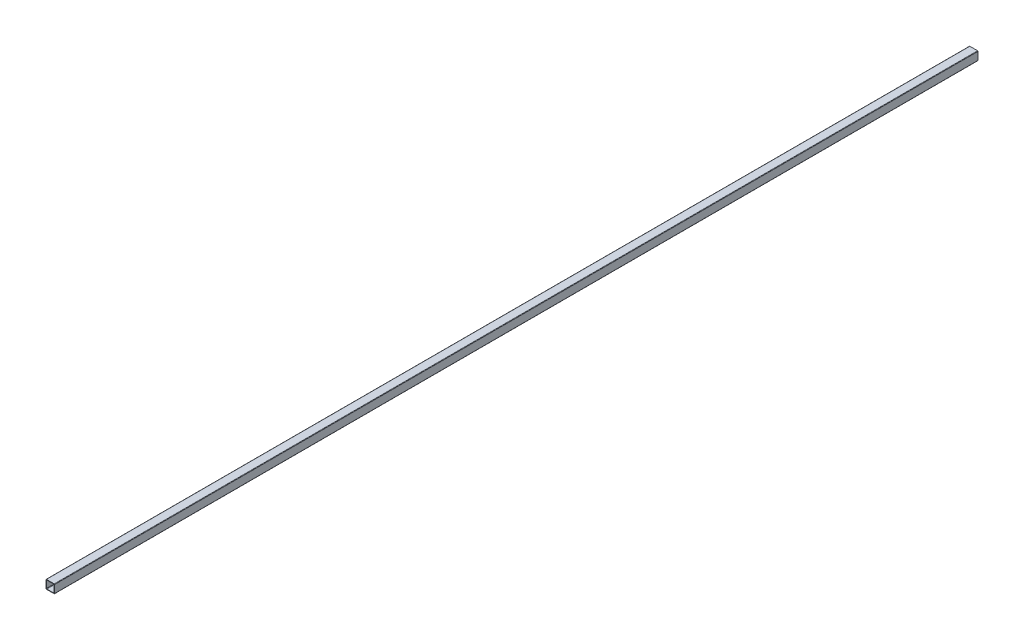
ISO-10303-21;
HEADER;
FILE_DESCRIPTION(('STEP AP214'),'2;1');
FILE_NAME('part.step','',(''),(''),'','','');
FILE_SCHEMA(('AUTOMOTIVE_DESIGN { 1 0 10303 214 1 1 1 1 }'));
ENDSEC;
DATA;
#1=APPLICATION_CONTEXT('core data for automotive mechanical design processes');
#2=APPLICATION_PROTOCOL_DEFINITION('international standard','automotive_design',2000,#1);
#3=PRODUCT_CONTEXT('',#1,'mechanical');
#4=PRODUCT('Part','Part','',(#3));
#5=PRODUCT_RELATED_PRODUCT_CATEGORY('part','',(#4));
#6=PRODUCT_DEFINITION_FORMATION('','',#4);
#7=PRODUCT_DEFINITION_CONTEXT('part definition',#1,'design');
#8=PRODUCT_DEFINITION('design','',#6,#7);
#9=PRODUCT_DEFINITION_SHAPE('','',#8);
#10=(LENGTH_UNIT() NAMED_UNIT(*) SI_UNIT(.MILLI.,.METRE.));
#11=(NAMED_UNIT(*) PLANE_ANGLE_UNIT() SI_UNIT($,.RADIAN.));
#12=(NAMED_UNIT(*) SI_UNIT($,.STERADIAN.) SOLID_ANGLE_UNIT());
#13=UNCERTAINTY_MEASURE_WITH_UNIT(LENGTH_MEASURE(1.E-05),#10,'distance_accuracy_value','');
#14=(GEOMETRIC_REPRESENTATION_CONTEXT(3) GLOBAL_UNCERTAINTY_ASSIGNED_CONTEXT((#13)) GLOBAL_UNIT_ASSIGNED_CONTEXT((#10,
#11,#12)) REPRESENTATION_CONTEXT('',''));
#15=CARTESIAN_POINT('',(0.,0.,0.));
#16=DIRECTION('',(0.,0.,1.));
#17=DIRECTION('',(1.,0.,0.));
#18=AXIS2_PLACEMENT_3D('',#15,#16,#17);
#19=CARTESIAN_POINT('',(18.,18.,4300.));
#20=DIRECTION('',(0.,0.,1.));
#21=DIRECTION('',(1.,0.,0.));
#22=AXIS2_PLACEMENT_3D('',#19,#20,#21);
#23=PLANE('',#22);
#24=CARTESIAN_POINT('',(18.,18.,4300.));
#25=DIRECTION('',(0.,0.,1.));
#26=DIRECTION('',(1.,0.,0.));
#27=AXIS2_PLACEMENT_3D('',#24,#25,#26);
#28=CIRCLE('',#27,2.);
#29=CARTESIAN_POINT('',(20.,18.,4300.));
#30=VERTEX_POINT('',#29);
#31=CARTESIAN_POINT('',(18.,20.,4300.));
#32=VERTEX_POINT('',#31);
#33=EDGE_CURVE('E213',#30,#32,#28,.T.);
#34=ORIENTED_EDGE('',*,*,#33,.T.);
#35=DIRECTION('',(-1.,0.,0.));
#36=VECTOR('',#35,1.);
#37=CARTESIAN_POINT('',(18.,20.,4300.));
#38=LINE('',#37,#36);
#39=CARTESIAN_POINT('',(-18.,20.,4300.));
#40=VERTEX_POINT('',#39);
#41=EDGE_CURVE('E216',#32,#40,#38,.T.);
#42=ORIENTED_EDGE('',*,*,#41,.T.);
#43=CARTESIAN_POINT('',(-18.,18.,4300.));
#44=DIRECTION('',(0.,0.,1.));
#45=DIRECTION('',(1.,0.,0.));
#46=AXIS2_PLACEMENT_3D('',#43,#44,#45);
#47=CIRCLE('',#46,2.);
#48=CARTESIAN_POINT('',(-20.,18.,4300.));
#49=VERTEX_POINT('',#48);
#50=EDGE_CURVE('E219',#40,#49,#47,.T.);
#51=ORIENTED_EDGE('',*,*,#50,.T.);
#52=DIRECTION('',(0.,-1.,0.));
#53=VECTOR('',#52,1.);
#54=CARTESIAN_POINT('',(-20.,-18.,4300.));
#55=LINE('',#54,#53);
#56=CARTESIAN_POINT('',(-20.,-18.,4300.));
#57=VERTEX_POINT('',#56);
#58=EDGE_CURVE('E221',#49,#57,#55,.T.);
#59=ORIENTED_EDGE('',*,*,#58,.T.);
#60=CARTESIAN_POINT('',(-18.,-18.,4300.));
#61=DIRECTION('',(0.,0.,1.));
#62=DIRECTION('',(-1.,0.,0.));
#63=AXIS2_PLACEMENT_3D('',#60,#61,#62);
#64=CIRCLE('',#63,2.);
#65=CARTESIAN_POINT('',(-18.,-20.,4300.));
#66=VERTEX_POINT('',#65);
#67=EDGE_CURVE('E223',#57,#66,#64,.T.);
#68=ORIENTED_EDGE('',*,*,#67,.T.);
#69=DIRECTION('',(1.,0.,0.));
#70=VECTOR('',#69,1.);
#71=CARTESIAN_POINT('',(18.,-20.,4300.));
#72=LINE('',#71,#70);
#73=CARTESIAN_POINT('',(18.,-20.,4300.));
#74=VERTEX_POINT('',#73);
#75=EDGE_CURVE('E225',#66,#74,#72,.T.);
#76=ORIENTED_EDGE('',*,*,#75,.T.);
#77=CARTESIAN_POINT('',(18.,-18.,4300.));
#78=DIRECTION('',(0.,0.,1.));
#79=DIRECTION('',(1.,0.,0.));
#80=AXIS2_PLACEMENT_3D('',#77,#78,#79);
#81=CIRCLE('',#80,2.);
#82=CARTESIAN_POINT('',(20.,-18.,4300.));
#83=VERTEX_POINT('',#82);
#84=EDGE_CURVE('E227',#74,#83,#81,.T.);
#85=ORIENTED_EDGE('',*,*,#84,.T.);
#86=DIRECTION('',(0.,1.,0.));
#87=VECTOR('',#86,1.);
#88=CARTESIAN_POINT('',(20.,-18.,4300.));
#89=LINE('',#88,#87);
#90=EDGE_CURVE('E229',#83,#30,#89,.T.);
#91=ORIENTED_EDGE('',*,*,#90,.T.);
#92=EDGE_LOOP('',(#34,#42,#51,#59,#68,#76,#85,#91));
#93=FACE_BOUND('',#92,.T.);
#94=DIRECTION('',(-1.,0.,0.));
#95=VECTOR('',#94,1.);
#96=CARTESIAN_POINT('',(16.,18.,4300.));
#97=LINE('',#96,#95);
#98=CARTESIAN_POINT('',(16.,18.,4300.));
#99=VERTEX_POINT('',#98);
#100=CARTESIAN_POINT('',(-16.,18.,4300.));
#101=VERTEX_POINT('',#100);
#102=EDGE_CURVE('E156',#99,#101,#97,.T.);
#103=ORIENTED_EDGE('',*,*,#102,.F.);
#104=CARTESIAN_POINT('',(16.,16.,4300.));
#105=DIRECTION('',(0.,0.,1.));
#106=DIRECTION('',(1.,0.,0.));
#107=AXIS2_PLACEMENT_3D('',#104,#105,#106);
#108=CIRCLE('',#107,2.);
#109=CARTESIAN_POINT('',(18.,16.,4300.));
#110=VERTEX_POINT('',#109);
#111=EDGE_CURVE('E148',#110,#99,#108,.T.);
#112=ORIENTED_EDGE('',*,*,#111,.F.);
#113=DIRECTION('',(0.,1.,0.));
#114=VECTOR('',#113,1.);
#115=CARTESIAN_POINT('',(18.,-16.,4300.));
#116=LINE('',#115,#114);
#117=CARTESIAN_POINT('',(18.,-16.,4300.));
#118=VERTEX_POINT('',#117);
#119=EDGE_CURVE('E181',#118,#110,#116,.T.);
#120=ORIENTED_EDGE('',*,*,#119,.F.);
#121=CARTESIAN_POINT('',(16.,-16.,4300.));
#122=DIRECTION('',(0.,0.,1.));
#123=DIRECTION('',(1.,0.,0.));
#124=AXIS2_PLACEMENT_3D('',#121,#122,#123);
#125=CIRCLE('',#124,2.);
#126=CARTESIAN_POINT('',(16.,-18.,4300.));
#127=VERTEX_POINT('',#126);
#128=EDGE_CURVE('E179',#127,#118,#125,.T.);
#129=ORIENTED_EDGE('',*,*,#128,.F.);
#130=DIRECTION('',(1.,0.,0.));
#131=VECTOR('',#130,1.);
#132=CARTESIAN_POINT('',(16.,-18.,4300.));
#133=LINE('',#132,#131);
#134=CARTESIAN_POINT('',(-16.,-18.,4300.));
#135=VERTEX_POINT('',#134);
#136=EDGE_CURVE('E177',#135,#127,#133,.T.);
#137=ORIENTED_EDGE('',*,*,#136,.F.);
#138=CARTESIAN_POINT('',(-16.,-16.,4300.));
#139=DIRECTION('',(0.,0.,1.));
#140=DIRECTION('',(-1.,0.,0.));
#141=AXIS2_PLACEMENT_3D('',#138,#139,#140);
#142=CIRCLE('',#141,2.);
#143=CARTESIAN_POINT('',(-18.,-16.,4300.));
#144=VERTEX_POINT('',#143);
#145=EDGE_CURVE('E175',#144,#135,#142,.T.);
#146=ORIENTED_EDGE('',*,*,#145,.F.);
#147=DIRECTION('',(0.,-1.,0.));
#148=VECTOR('',#147,1.);
#149=CARTESIAN_POINT('',(-18.,-16.,4300.));
#150=LINE('',#149,#148);
#151=CARTESIAN_POINT('',(-18.,16.,4300.));
#152=VERTEX_POINT('',#151);
#153=EDGE_CURVE('E171',#152,#144,#150,.T.);
#154=ORIENTED_EDGE('',*,*,#153,.F.);
#155=CARTESIAN_POINT('',(-16.,16.,4300.));
#156=DIRECTION('',(0.,0.,1.));
#157=DIRECTION('',(1.,0.,0.));
#158=AXIS2_PLACEMENT_3D('',#155,#156,#157);
#159=CIRCLE('',#158,2.);
#160=EDGE_CURVE('E169',#101,#152,#159,.T.);
#161=ORIENTED_EDGE('',*,*,#160,.F.);
#162=EDGE_LOOP('',(#103,#112,#120,#129,#137,#146,#154,#161));
#163=FACE_BOUND('',#162,.T.);
#164=ADVANCED_FACE('F35',(#93,#163),#23,.T.);
#165=CARTESIAN_POINT('',(18.,18.,0.));
#166=DIRECTION('',(0.,0.,1.));
#167=DIRECTION('',(1.,0.,0.));
#168=AXIS2_PLACEMENT_3D('',#165,#166,#167);
#169=PLANE('',#168);
#170=CARTESIAN_POINT('',(18.,18.,0.));
#171=DIRECTION('',(0.,0.,1.));
#172=DIRECTION('',(1.,0.,0.));
#173=AXIS2_PLACEMENT_3D('',#170,#171,#172);
#174=CIRCLE('',#173,2.);
#175=CARTESIAN_POINT('',(20.,18.,0.));
#176=VERTEX_POINT('',#175);
#177=CARTESIAN_POINT('',(18.,20.,0.));
#178=VERTEX_POINT('',#177);
#179=EDGE_CURVE('E164',#176,#178,#174,.T.);
#180=ORIENTED_EDGE('',*,*,#179,.F.);
#181=DIRECTION('',(0.,1.,0.));
#182=VECTOR('',#181,1.);
#183=CARTESIAN_POINT('',(20.,-18.,0.));
#184=LINE('',#183,#182);
#185=CARTESIAN_POINT('',(20.,-18.,0.));
#186=VERTEX_POINT('',#185);
#187=EDGE_CURVE('E217',#186,#176,#184,.T.);
#188=ORIENTED_EDGE('',*,*,#187,.F.);
#189=CARTESIAN_POINT('',(18.,-18.,0.));
#190=DIRECTION('',(0.,0.,1.));
#191=DIRECTION('',(1.,0.,0.));
#192=AXIS2_PLACEMENT_3D('',#189,#190,#191);
#193=CIRCLE('',#192,2.);
#194=CARTESIAN_POINT('',(18.,-20.,0.));
#195=VERTEX_POINT('',#194);
#196=EDGE_CURVE('E244',#195,#186,#193,.T.);
#197=ORIENTED_EDGE('',*,*,#196,.F.);
#198=DIRECTION('',(1.,0.,0.));
#199=VECTOR('',#198,1.);
#200=CARTESIAN_POINT('',(18.,-20.,0.));
#201=LINE('',#200,#199);
#202=CARTESIAN_POINT('',(-18.,-20.,0.));
#203=VERTEX_POINT('',#202);
#204=EDGE_CURVE('E242',#203,#195,#201,.T.);
#205=ORIENTED_EDGE('',*,*,#204,.F.);
#206=CARTESIAN_POINT('',(-18.,-18.,0.));
#207=DIRECTION('',(0.,0.,1.));
#208=DIRECTION('',(-1.,0.,0.));
#209=AXIS2_PLACEMENT_3D('',#206,#207,#208);
#210=CIRCLE('',#209,2.);
#211=CARTESIAN_POINT('',(-20.,-18.,0.));
#212=VERTEX_POINT('',#211);
#213=EDGE_CURVE('E240',#212,#203,#210,.T.);
#214=ORIENTED_EDGE('',*,*,#213,.F.);
#215=DIRECTION('',(0.,-1.,0.));
#216=VECTOR('',#215,1.);
#217=CARTESIAN_POINT('',(-20.,-18.,0.));
#218=LINE('',#217,#216);
#219=CARTESIAN_POINT('',(-20.,18.,0.));
#220=VERTEX_POINT('',#219);
#221=EDGE_CURVE('E238',#220,#212,#218,.T.);
#222=ORIENTED_EDGE('',*,*,#221,.F.);
#223=CARTESIAN_POINT('',(-18.,18.,0.));
#224=DIRECTION('',(0.,0.,1.));
#225=DIRECTION('',(1.,0.,0.));
#226=AXIS2_PLACEMENT_3D('',#223,#224,#225);
#227=CIRCLE('',#226,2.);
#228=CARTESIAN_POINT('',(-18.,20.,0.));
#229=VERTEX_POINT('',#228);
#230=EDGE_CURVE('E236',#229,#220,#227,.T.);
#231=ORIENTED_EDGE('',*,*,#230,.F.);
#232=DIRECTION('',(-1.,0.,0.));
#233=VECTOR('',#232,1.);
#234=CARTESIAN_POINT('',(18.,20.,0.));
#235=LINE('',#234,#233);
#236=EDGE_CURVE('E234',#178,#229,#235,.T.);
#237=ORIENTED_EDGE('',*,*,#236,.F.);
#238=EDGE_LOOP('',(#180,#188,#197,#205,#214,#222,#231,#237));
#239=FACE_BOUND('',#238,.T.);
#240=CARTESIAN_POINT('',(16.,16.,0.));
#241=DIRECTION('',(0.,0.,1.));
#242=DIRECTION('',(1.,0.,0.));
#243=AXIS2_PLACEMENT_3D('',#240,#241,#242);
#244=CIRCLE('',#243,2.);
#245=CARTESIAN_POINT('',(18.,16.,0.));
#246=VERTEX_POINT('',#245);
#247=CARTESIAN_POINT('',(16.,18.,0.));
#248=VERTEX_POINT('',#247);
#249=EDGE_CURVE('E58',#246,#248,#244,.T.);
#250=ORIENTED_EDGE('',*,*,#249,.T.);
#251=DIRECTION('',(-1.,0.,0.));
#252=VECTOR('',#251,1.);
#253=CARTESIAN_POINT('',(16.,18.,0.));
#254=LINE('',#253,#252);
#255=CARTESIAN_POINT('',(-16.,18.,0.));
#256=VERTEX_POINT('',#255);
#257=EDGE_CURVE('E163',#248,#256,#254,.T.);
#258=ORIENTED_EDGE('',*,*,#257,.T.);
#259=CARTESIAN_POINT('',(-16.,16.,0.));
#260=DIRECTION('',(0.,0.,1.));
#261=DIRECTION('',(1.,0.,0.));
#262=AXIS2_PLACEMENT_3D('',#259,#260,#261);
#263=CIRCLE('',#262,2.);
#264=CARTESIAN_POINT('',(-18.,16.,0.));
#265=VERTEX_POINT('',#264);
#266=EDGE_CURVE('E185',#256,#265,#263,.T.);
#267=ORIENTED_EDGE('',*,*,#266,.T.);
#268=DIRECTION('',(0.,-1.,0.));
#269=VECTOR('',#268,1.);
#270=CARTESIAN_POINT('',(-18.,-16.,0.));
#271=LINE('',#270,#269);
#272=CARTESIAN_POINT('',(-18.,-16.,0.));
#273=VERTEX_POINT('',#272);
#274=EDGE_CURVE('E188',#265,#273,#271,.T.);
#275=ORIENTED_EDGE('',*,*,#274,.T.);
#276=CARTESIAN_POINT('',(-16.,-16.,0.));
#277=DIRECTION('',(0.,0.,1.));
#278=DIRECTION('',(-1.,0.,0.));
#279=AXIS2_PLACEMENT_3D('',#276,#277,#278);
#280=CIRCLE('',#279,2.);
#281=CARTESIAN_POINT('',(-16.,-18.,0.));
#282=VERTEX_POINT('',#281);
#283=EDGE_CURVE('E191',#273,#282,#280,.T.);
#284=ORIENTED_EDGE('',*,*,#283,.T.);
#285=DIRECTION('',(1.,0.,0.));
#286=VECTOR('',#285,1.);
#287=CARTESIAN_POINT('',(16.,-18.,0.));
#288=LINE('',#287,#286);
#289=CARTESIAN_POINT('',(16.,-18.,0.));
#290=VERTEX_POINT('',#289);
#291=EDGE_CURVE('E194',#282,#290,#288,.T.);
#292=ORIENTED_EDGE('',*,*,#291,.T.);
#293=CARTESIAN_POINT('',(16.,-16.,0.));
#294=DIRECTION('',(0.,0.,1.));
#295=DIRECTION('',(1.,0.,0.));
#296=AXIS2_PLACEMENT_3D('',#293,#294,#295);
#297=CIRCLE('',#296,2.);
#298=CARTESIAN_POINT('',(18.,-16.,0.));
#299=VERTEX_POINT('',#298);
#300=EDGE_CURVE('E197',#290,#299,#297,.T.);
#301=ORIENTED_EDGE('',*,*,#300,.T.);
#302=DIRECTION('',(0.,1.,0.));
#303=VECTOR('',#302,1.);
#304=CARTESIAN_POINT('',(18.,-16.,0.));
#305=LINE('',#304,#303);
#306=EDGE_CURVE('E157',#299,#246,#305,.T.);
#307=ORIENTED_EDGE('',*,*,#306,.T.);
#308=EDGE_LOOP('',(#250,#258,#267,#275,#284,#292,#301,#307));
#309=FACE_BOUND('',#308,.T.);
#310=ADVANCED_FACE('F274',(#239,#309),#169,.F.);
#311=CARTESIAN_POINT('',(18.,18.,4300.));
#312=DIRECTION('',(0.,0.,-1.));
#313=DIRECTION('',(-1.,0.,0.));
#314=AXIS2_PLACEMENT_3D('',#311,#312,#313);
#315=CYLINDRICAL_SURFACE('',#314,2.);
#316=ORIENTED_EDGE('',*,*,#179,.T.);
#317=DIRECTION('',(0.,0.,-1.));
#318=VECTOR('',#317,1.);
#319=CARTESIAN_POINT('',(18.,20.,4300.));
#320=LINE('',#319,#318);
#321=EDGE_CURVE('E11',#32,#178,#320,.T.);
#322=ORIENTED_EDGE('',*,*,#321,.F.);
#323=ORIENTED_EDGE('',*,*,#33,.F.);
#324=DIRECTION('',(0.,0.,-1.));
#325=VECTOR('',#324,1.);
#326=CARTESIAN_POINT('',(20.,18.,4300.));
#327=LINE('',#326,#325);
#328=EDGE_CURVE('E231',#30,#176,#327,.T.);
#329=ORIENTED_EDGE('',*,*,#328,.T.);
#330=EDGE_LOOP('',(#316,#322,#323,#329));
#331=FACE_BOUND('',#330,.T.);
#332=ADVANCED_FACE('F37',(#331),#315,.T.);
#333=CARTESIAN_POINT('',(18.,20.,4300.));
#334=DIRECTION('',(0.,-1.,0.));
#335=DIRECTION('',(1.,0.,0.));
#336=AXIS2_PLACEMENT_3D('',#333,#334,#335);
#337=PLANE('',#336);
#338=ORIENTED_EDGE('',*,*,#236,.T.);
#339=DIRECTION('',(0.,0.,-1.));
#340=VECTOR('',#339,1.);
#341=CARTESIAN_POINT('',(-18.,20.,4300.));
#342=LINE('',#341,#340);
#343=EDGE_CURVE('E43',#40,#229,#342,.T.);
#344=ORIENTED_EDGE('',*,*,#343,.F.);
#345=ORIENTED_EDGE('',*,*,#41,.F.);
#346=ORIENTED_EDGE('',*,*,#321,.T.);
#347=EDGE_LOOP('',(#338,#344,#345,#346));
#348=FACE_BOUND('',#347,.T.);
#349=ADVANCED_FACE('F291',(#348),#337,.F.);
#350=CARTESIAN_POINT('',(-18.,18.,4300.));
#351=DIRECTION('',(0.,0.,-1.));
#352=DIRECTION('',(-1.,0.,0.));
#353=AXIS2_PLACEMENT_3D('',#350,#351,#352);
#354=CYLINDRICAL_SURFACE('',#353,2.);
#355=ORIENTED_EDGE('',*,*,#230,.T.);
#356=DIRECTION('',(0.,0.,-1.));
#357=VECTOR('',#356,1.);
#358=CARTESIAN_POINT('',(-20.,18.,4300.));
#359=LINE('',#358,#357);
#360=EDGE_CURVE('E261',#49,#220,#359,.T.);
#361=ORIENTED_EDGE('',*,*,#360,.F.);
#362=ORIENTED_EDGE('',*,*,#50,.F.);
#363=ORIENTED_EDGE('',*,*,#343,.T.);
#364=EDGE_LOOP('',(#355,#361,#362,#363));
#365=FACE_BOUND('',#364,.T.);
#366=ADVANCED_FACE('F268',(#365),#354,.T.);
#367=CARTESIAN_POINT('',(-20.,-18.,4300.));
#368=DIRECTION('',(1.,0.,0.));
#369=DIRECTION('',(0.,0.,-1.));
#370=AXIS2_PLACEMENT_3D('',#367,#368,#369);
#371=PLANE('',#370);
#372=ORIENTED_EDGE('',*,*,#221,.T.);
#373=DIRECTION('',(0.,0.,-1.));
#374=VECTOR('',#373,1.);
#375=CARTESIAN_POINT('',(-20.,-18.,4300.));
#376=LINE('',#375,#374);
#377=EDGE_CURVE('E258',#57,#212,#376,.T.);
#378=ORIENTED_EDGE('',*,*,#377,.F.);
#379=ORIENTED_EDGE('',*,*,#58,.F.);
#380=ORIENTED_EDGE('',*,*,#360,.T.);
#381=EDGE_LOOP('',(#372,#378,#379,#380));
#382=FACE_BOUND('',#381,.T.);
#383=ADVANCED_FACE('F280',(#382),#371,.F.);
#384=CARTESIAN_POINT('',(-18.,-18.,4300.));
#385=DIRECTION('',(0.,0.,-1.));
#386=DIRECTION('',(-1.,0.,0.));
#387=AXIS2_PLACEMENT_3D('',#384,#385,#386);
#388=CYLINDRICAL_SURFACE('',#387,2.);
#389=ORIENTED_EDGE('',*,*,#213,.T.);
#390=DIRECTION('',(0.,0.,-1.));
#391=VECTOR('',#390,1.);
#392=CARTESIAN_POINT('',(-18.,-20.,4300.));
#393=LINE('',#392,#391);
#394=EDGE_CURVE('E255',#66,#203,#393,.T.);
#395=ORIENTED_EDGE('',*,*,#394,.F.);
#396=ORIENTED_EDGE('',*,*,#67,.F.);
#397=ORIENTED_EDGE('',*,*,#377,.T.);
#398=EDGE_LOOP('',(#389,#395,#396,#397));
#399=FACE_BOUND('',#398,.T.);
#400=ADVANCED_FACE('F284',(#399),#388,.T.);
#401=CARTESIAN_POINT('',(18.,-20.,4300.));
#402=DIRECTION('',(0.,1.,0.));
#403=DIRECTION('',(-1.,0.,0.));
#404=AXIS2_PLACEMENT_3D('',#401,#402,#403);
#405=PLANE('',#404);
#406=ORIENTED_EDGE('',*,*,#204,.T.);
#407=DIRECTION('',(0.,0.,-1.));
#408=VECTOR('',#407,1.);
#409=CARTESIAN_POINT('',(18.,-20.,4300.));
#410=LINE('',#409,#408);
#411=EDGE_CURVE('E252',#74,#195,#410,.T.);
#412=ORIENTED_EDGE('',*,*,#411,.F.);
#413=ORIENTED_EDGE('',*,*,#75,.F.);
#414=ORIENTED_EDGE('',*,*,#394,.T.);
#415=EDGE_LOOP('',(#406,#412,#413,#414));
#416=FACE_BOUND('',#415,.T.);
#417=ADVANCED_FACE('F304',(#416),#405,.F.);
#418=CARTESIAN_POINT('',(18.,-18.,4300.));
#419=DIRECTION('',(0.,0.,-1.));
#420=DIRECTION('',(-1.,0.,0.));
#421=AXIS2_PLACEMENT_3D('',#418,#419,#420);
#422=CYLINDRICAL_SURFACE('',#421,2.);
#423=ORIENTED_EDGE('',*,*,#196,.T.);
#424=DIRECTION('',(0.,0.,-1.));
#425=VECTOR('',#424,1.);
#426=CARTESIAN_POINT('',(20.,-18.,4300.));
#427=LINE('',#426,#425);
#428=EDGE_CURVE('E249',#83,#186,#427,.T.);
#429=ORIENTED_EDGE('',*,*,#428,.F.);
#430=ORIENTED_EDGE('',*,*,#84,.F.);
#431=ORIENTED_EDGE('',*,*,#411,.T.);
#432=EDGE_LOOP('',(#423,#429,#430,#431));
#433=FACE_BOUND('',#432,.T.);
#434=ADVANCED_FACE('F302',(#433),#422,.T.);
#435=CARTESIAN_POINT('',(20.,-18.,4300.));
#436=DIRECTION('',(-1.,0.,0.));
#437=DIRECTION('',(0.,0.,1.));
#438=AXIS2_PLACEMENT_3D('',#435,#436,#437);
#439=PLANE('',#438);
#440=ORIENTED_EDGE('',*,*,#187,.T.);
#441=ORIENTED_EDGE('',*,*,#328,.F.);
#442=ORIENTED_EDGE('',*,*,#90,.F.);
#443=ORIENTED_EDGE('',*,*,#428,.T.);
#444=EDGE_LOOP('',(#440,#441,#442,#443));
#445=FACE_BOUND('',#444,.T.);
#446=ADVANCED_FACE('F297',(#445),#439,.F.);
#447=CARTESIAN_POINT('',(16.,16.,4300.));
#448=DIRECTION('',(0.,0.,-1.));
#449=DIRECTION('',(-1.,0.,0.));
#450=AXIS2_PLACEMENT_3D('',#447,#448,#449);
#451=CYLINDRICAL_SURFACE('',#450,2.);
#452=ORIENTED_EDGE('',*,*,#249,.F.);
#453=DIRECTION('',(0.,0.,-1.));
#454=VECTOR('',#453,1.);
#455=CARTESIAN_POINT('',(18.,16.,4300.));
#456=LINE('',#455,#454);
#457=EDGE_CURVE('E152',#110,#246,#456,.T.);
#458=ORIENTED_EDGE('',*,*,#457,.F.);
#459=ORIENTED_EDGE('',*,*,#111,.T.);
#460=DIRECTION('',(0.,0.,-1.));
#461=VECTOR('',#460,1.);
#462=CARTESIAN_POINT('',(16.,18.,4300.));
#463=LINE('',#462,#461);
#464=EDGE_CURVE('E151',#99,#248,#463,.T.);
#465=ORIENTED_EDGE('',*,*,#464,.T.);
#466=EDGE_LOOP('',(#452,#458,#459,#465));
#467=FACE_BOUND('',#466,.T.);
#468=ADVANCED_FACE('F150',(#467),#451,.F.);
#469=CARTESIAN_POINT('',(16.,18.,4300.));
#470=DIRECTION('',(0.,-1.,0.));
#471=DIRECTION('',(0.,0.,-1.));
#472=AXIS2_PLACEMENT_3D('',#469,#470,#471);
#473=PLANE('',#472);
#474=ORIENTED_EDGE('',*,*,#257,.F.);
#475=ORIENTED_EDGE('',*,*,#464,.F.);
#476=ORIENTED_EDGE('',*,*,#102,.T.);
#477=DIRECTION('',(0.,0.,-1.));
#478=VECTOR('',#477,1.);
#479=CARTESIAN_POINT('',(-16.,18.,4300.));
#480=LINE('',#479,#478);
#481=EDGE_CURVE('E165',#101,#256,#480,.T.);
#482=ORIENTED_EDGE('',*,*,#481,.T.);
#483=EDGE_LOOP('',(#474,#475,#476,#482));
#484=FACE_BOUND('',#483,.T.);
#485=ADVANCED_FACE('F160',(#484),#473,.T.);
#486=CARTESIAN_POINT('',(-16.,16.,4300.));
#487=DIRECTION('',(0.,0.,-1.));
#488=DIRECTION('',(-1.,0.,0.));
#489=AXIS2_PLACEMENT_3D('',#486,#487,#488);
#490=CYLINDRICAL_SURFACE('',#489,2.);
#491=ORIENTED_EDGE('',*,*,#266,.F.);
#492=ORIENTED_EDGE('',*,*,#481,.F.);
#493=ORIENTED_EDGE('',*,*,#160,.T.);
#494=DIRECTION('',(0.,0.,-1.));
#495=VECTOR('',#494,1.);
#496=CARTESIAN_POINT('',(-18.,16.,4300.));
#497=LINE('',#496,#495);
#498=EDGE_CURVE('E210',#152,#265,#497,.T.);
#499=ORIENTED_EDGE('',*,*,#498,.T.);
#500=EDGE_LOOP('',(#491,#492,#493,#499));
#501=FACE_BOUND('',#500,.T.);
#502=ADVANCED_FACE('F329',(#501),#490,.F.);
#503=CARTESIAN_POINT('',(-18.,-16.,4300.));
#504=DIRECTION('',(1.,0.,0.));
#505=DIRECTION('',(0.,0.,-1.));
#506=AXIS2_PLACEMENT_3D('',#503,#504,#505);
#507=PLANE('',#506);
#508=ORIENTED_EDGE('',*,*,#274,.F.);
#509=ORIENTED_EDGE('',*,*,#498,.F.);
#510=ORIENTED_EDGE('',*,*,#153,.T.);
#511=DIRECTION('',(0.,0.,-1.));
#512=VECTOR('',#511,1.);
#513=CARTESIAN_POINT('',(-18.,-16.,4300.));
#514=LINE('',#513,#512);
#515=EDGE_CURVE('E208',#144,#273,#514,.T.);
#516=ORIENTED_EDGE('',*,*,#515,.T.);
#517=EDGE_LOOP('',(#508,#509,#510,#516));
#518=FACE_BOUND('',#517,.T.);
#519=ADVANCED_FACE('F333',(#518),#507,.T.);
#520=CARTESIAN_POINT('',(-16.,-16.,4300.));
#521=DIRECTION('',(0.,0.,-1.));
#522=DIRECTION('',(-1.,0.,0.));
#523=AXIS2_PLACEMENT_3D('',#520,#521,#522);
#524=CYLINDRICAL_SURFACE('',#523,2.);
#525=ORIENTED_EDGE('',*,*,#283,.F.);
#526=ORIENTED_EDGE('',*,*,#515,.F.);
#527=ORIENTED_EDGE('',*,*,#145,.T.);
#528=DIRECTION('',(0.,0.,-1.));
#529=VECTOR('',#528,1.);
#530=CARTESIAN_POINT('',(-16.,-18.,4300.));
#531=LINE('',#530,#529);
#532=EDGE_CURVE('E206',#135,#282,#531,.T.);
#533=ORIENTED_EDGE('',*,*,#532,.T.);
#534=EDGE_LOOP('',(#525,#526,#527,#533));
#535=FACE_BOUND('',#534,.T.);
#536=ADVANCED_FACE('F339',(#535),#524,.F.);
#537=CARTESIAN_POINT('',(16.,-18.,4300.));
#538=DIRECTION('',(0.,1.,0.));
#539=DIRECTION('',(0.,0.,1.));
#540=AXIS2_PLACEMENT_3D('',#537,#538,#539);
#541=PLANE('',#540);
#542=ORIENTED_EDGE('',*,*,#291,.F.);
#543=ORIENTED_EDGE('',*,*,#532,.F.);
#544=ORIENTED_EDGE('',*,*,#136,.T.);
#545=DIRECTION('',(0.,0.,-1.));
#546=VECTOR('',#545,1.);
#547=CARTESIAN_POINT('',(16.,-18.,4300.));
#548=LINE('',#547,#546);
#549=EDGE_CURVE('E204',#127,#290,#548,.T.);
#550=ORIENTED_EDGE('',*,*,#549,.T.);
#551=EDGE_LOOP('',(#542,#543,#544,#550));
#552=FACE_BOUND('',#551,.T.);
#553=ADVANCED_FACE('F343',(#552),#541,.T.);
#554=CARTESIAN_POINT('',(16.,-16.,4300.));
#555=DIRECTION('',(0.,0.,-1.));
#556=DIRECTION('',(-1.,0.,0.));
#557=AXIS2_PLACEMENT_3D('',#554,#555,#556);
#558=CYLINDRICAL_SURFACE('',#557,2.);
#559=ORIENTED_EDGE('',*,*,#300,.F.);
#560=ORIENTED_EDGE('',*,*,#549,.F.);
#561=ORIENTED_EDGE('',*,*,#128,.T.);
#562=DIRECTION('',(0.,0.,-1.));
#563=VECTOR('',#562,1.);
#564=CARTESIAN_POINT('',(18.,-16.,4300.));
#565=LINE('',#564,#563);
#566=EDGE_CURVE('E50',#118,#299,#565,.T.);
#567=ORIENTED_EDGE('',*,*,#566,.T.);
#568=EDGE_LOOP('',(#559,#560,#561,#567));
#569=FACE_BOUND('',#568,.T.);
#570=ADVANCED_FACE('F347',(#569),#558,.F.);
#571=CARTESIAN_POINT('',(18.,-16.,4300.));
#572=DIRECTION('',(-1.,0.,0.));
#573=DIRECTION('',(0.,0.,1.));
#574=AXIS2_PLACEMENT_3D('',#571,#572,#573);
#575=PLANE('',#574);
#576=ORIENTED_EDGE('',*,*,#306,.F.);
#577=ORIENTED_EDGE('',*,*,#566,.F.);
#578=ORIENTED_EDGE('',*,*,#119,.T.);
#579=ORIENTED_EDGE('',*,*,#457,.T.);
#580=EDGE_LOOP('',(#576,#577,#578,#579));
#581=FACE_BOUND('',#580,.T.);
#582=ADVANCED_FACE('F351',(#581),#575,.T.);
#583=CLOSED_SHELL('',(#164,#310,#332,#349,#366,#383,#400,#417,#434,#446,#468,#485,#502,#519,
#536,#553,#570,#582));
#584=MANIFOLD_SOLID_BREP('B2',#583);
#585=ADVANCED_BREP_SHAPE_REPRESENTATION('',(#18,#584),#14);
#586=SHAPE_DEFINITION_REPRESENTATION(#9,#585);
ENDSEC;
END-ISO-10303-21;
